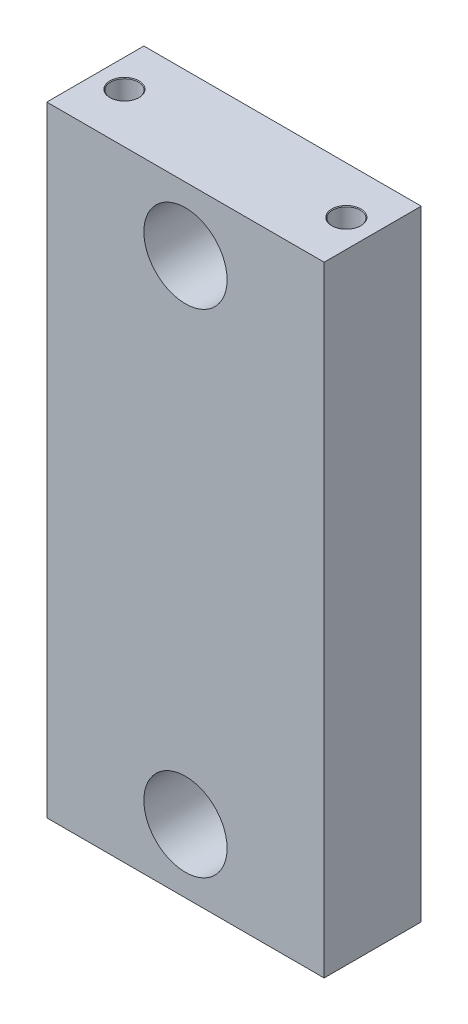
ISO-10303-21;
HEADER;
FILE_DESCRIPTION(('STEP AP214'),'2;1');
FILE_NAME('part.step','',(''),(''),'','','');
FILE_SCHEMA(('AUTOMOTIVE_DESIGN { 1 0 10303 214 1 1 1 1 }'));
ENDSEC;
DATA;
#1=APPLICATION_CONTEXT('core data for automotive mechanical design processes');
#2=APPLICATION_PROTOCOL_DEFINITION('international standard','automotive_design',2000,#1);
#3=PRODUCT_CONTEXT('',#1,'mechanical');
#4=PRODUCT('Part','Part','',(#3));
#5=PRODUCT_RELATED_PRODUCT_CATEGORY('part','',(#4));
#6=PRODUCT_DEFINITION_FORMATION('','',#4);
#7=PRODUCT_DEFINITION_CONTEXT('part definition',#1,'design');
#8=PRODUCT_DEFINITION('design','',#6,#7);
#9=PRODUCT_DEFINITION_SHAPE('','',#8);
#10=(LENGTH_UNIT() NAMED_UNIT(*) SI_UNIT(.MILLI.,.METRE.));
#11=(NAMED_UNIT(*) PLANE_ANGLE_UNIT() SI_UNIT($,.RADIAN.));
#12=(NAMED_UNIT(*) SI_UNIT($,.STERADIAN.) SOLID_ANGLE_UNIT());
#13=UNCERTAINTY_MEASURE_WITH_UNIT(LENGTH_MEASURE(1.E-05),#10,'distance_accuracy_value','');
#14=(GEOMETRIC_REPRESENTATION_CONTEXT(3) GLOBAL_UNCERTAINTY_ASSIGNED_CONTEXT((#13)) GLOBAL_UNIT_ASSIGNED_CONTEXT((#10,
#11,#12)) REPRESENTATION_CONTEXT('',''));
#15=CARTESIAN_POINT('',(0.,0.,0.));
#16=DIRECTION('',(0.,0.,1.));
#17=DIRECTION('',(1.,0.,0.));
#18=AXIS2_PLACEMENT_3D('',#15,#16,#17);
#19=CARTESIAN_POINT('',(0.,-27.35,3.5));
#20=DIRECTION('',(0.,1.,0.));
#21=DIRECTION('',(0.,0.,1.));
#22=AXIS2_PLACEMENT_3D('',#19,#20,#21);
#23=PLANE('',#22);
#24=DIRECTION('',(1.,0.,0.));
#25=VECTOR('',#24,1.);
#26=CARTESIAN_POINT('',(0.,-27.35,0.));
#27=LINE('',#26,#25);
#28=CARTESIAN_POINT('',(-4.99999999999999,-27.35,0.));
#29=VERTEX_POINT('',#28);
#30=CARTESIAN_POINT('',(5.00000000000001,-27.35,0.));
#31=VERTEX_POINT('',#30);
#32=EDGE_CURVE('E161',#29,#31,#27,.T.);
#33=ORIENTED_EDGE('',*,*,#32,.T.);
#34=DIRECTION('',(0.,0.,-1.));
#35=VECTOR('',#34,1.);
#36=CARTESIAN_POINT('',(5.00000000000001,-27.35,3.5));
#37=LINE('',#36,#35);
#38=CARTESIAN_POINT('',(5.00000000000001,-27.35,3.5));
#39=VERTEX_POINT('',#38);
#40=EDGE_CURVE('E11',#39,#31,#37,.T.);
#41=ORIENTED_EDGE('',*,*,#40,.F.);
#42=DIRECTION('',(1.,0.,0.));
#43=VECTOR('',#42,1.);
#44=CARTESIAN_POINT('',(0.,-27.35,3.5));
#45=LINE('',#44,#43);
#46=CARTESIAN_POINT('',(-4.99999999999999,-27.35,3.5));
#47=VERTEX_POINT('',#46);
#48=EDGE_CURVE('E142',#47,#39,#45,.T.);
#49=ORIENTED_EDGE('',*,*,#48,.F.);
#50=DIRECTION('',(0.,0.,-1.));
#51=VECTOR('',#50,1.);
#52=CARTESIAN_POINT('',(-4.99999999999999,-27.35,3.5));
#53=LINE('',#52,#51);
#54=EDGE_CURVE('E67',#47,#29,#53,.T.);
#55=ORIENTED_EDGE('',*,*,#54,.T.);
#56=EDGE_LOOP('',(#33,#41,#49,#55));
#57=FACE_BOUND('',#56,.T.);
#58=ADVANCED_FACE('F49',(#57),#23,.F.);
#59=CARTESIAN_POINT('',(5.00000000000001,0.,3.5));
#60=DIRECTION('',(-1.,0.,0.));
#61=DIRECTION('',(0.,0.,1.));
#62=AXIS2_PLACEMENT_3D('',#59,#60,#61);
#63=PLANE('',#62);
#64=DIRECTION('',(0.,1.,0.));
#65=VECTOR('',#64,1.);
#66=CARTESIAN_POINT('',(5.00000000000001,0.,0.));
#67=LINE('',#66,#65);
#68=CARTESIAN_POINT('',(5.00000000000001,-5.,0.));
#69=VERTEX_POINT('',#68);
#70=EDGE_CURVE('E164',#31,#69,#67,.T.);
#71=ORIENTED_EDGE('',*,*,#70,.T.);
#72=DIRECTION('',(0.,0.,-1.));
#73=VECTOR('',#72,1.);
#74=CARTESIAN_POINT('',(5.00000000000001,-5.,3.5));
#75=LINE('',#74,#73);
#76=CARTESIAN_POINT('',(5.00000000000001,-5.,3.5));
#77=VERTEX_POINT('',#76);
#78=EDGE_CURVE('E59',#77,#69,#75,.T.);
#79=ORIENTED_EDGE('',*,*,#78,.F.);
#80=DIRECTION('',(0.,1.,0.));
#81=VECTOR('',#80,1.);
#82=CARTESIAN_POINT('',(5.00000000000001,0.,3.5));
#83=LINE('',#82,#81);
#84=EDGE_CURVE('E93',#39,#77,#83,.T.);
#85=ORIENTED_EDGE('',*,*,#84,.F.);
#86=ORIENTED_EDGE('',*,*,#40,.T.);
#87=EDGE_LOOP('',(#71,#79,#85,#86));
#88=FACE_BOUND('',#87,.T.);
#89=ADVANCED_FACE('F182',(#88),#63,.F.);
#90=CARTESIAN_POINT('',(0.,-5.,3.5));
#91=DIRECTION('',(0.,1.,0.));
#92=DIRECTION('',(-1.,0.,0.));
#93=AXIS2_PLACEMENT_3D('',#90,#91,#92);
#94=PLANE('',#93);
#95=CARTESIAN_POINT('',(-3.99999999999999,-5.,1.7));
#96=DIRECTION('',(0.,1.,0.));
#97=DIRECTION('',(0.,0.,1.));
#98=AXIS2_PLACEMENT_3D('',#95,#96,#97);
#99=CIRCLE('',#98,0.524999999999999);
#100=CARTESIAN_POINT('',(-3.99999999999999,-5.,2.225));
#101=VERTEX_POINT('',#100);
#102=EDGE_CURVE('E121',#101,#101,#99,.T.);
#103=ORIENTED_EDGE('',*,*,#102,.F.);
#104=EDGE_LOOP('',(#103));
#105=FACE_BOUND('',#104,.T.);
#106=CARTESIAN_POINT('',(4.00000000000001,-5.,1.7));
#107=DIRECTION('',(0.,1.,0.));
#108=DIRECTION('',(0.,0.,1.));
#109=AXIS2_PLACEMENT_3D('',#106,#107,#108);
#110=CIRCLE('',#109,0.524999999999999);
#111=CARTESIAN_POINT('',(4.00000000000001,-5.,2.225));
#112=VERTEX_POINT('',#111);
#113=EDGE_CURVE('E112',#112,#112,#110,.T.);
#114=ORIENTED_EDGE('',*,*,#113,.F.);
#115=EDGE_LOOP('',(#114));
#116=FACE_BOUND('',#115,.T.);
#117=DIRECTION('',(1.,0.,0.));
#118=VECTOR('',#117,1.);
#119=CARTESIAN_POINT('',(0.,-5.,0.));
#120=LINE('',#119,#118);
#121=CARTESIAN_POINT('',(-4.99999999999999,-5.,0.));
#122=VERTEX_POINT('',#121);
#123=EDGE_CURVE('E168',#122,#69,#120,.T.);
#124=ORIENTED_EDGE('',*,*,#123,.F.);
#125=DIRECTION('',(0.,0.,-1.));
#126=VECTOR('',#125,1.);
#127=CARTESIAN_POINT('',(-4.99999999999999,-5.,3.5));
#128=LINE('',#127,#126);
#129=CARTESIAN_POINT('',(-4.99999999999999,-5.,3.5));
#130=VERTEX_POINT('',#129);
#131=EDGE_CURVE('E82',#130,#122,#128,.T.);
#132=ORIENTED_EDGE('',*,*,#131,.F.);
#133=DIRECTION('',(1.,0.,0.));
#134=VECTOR('',#133,1.);
#135=CARTESIAN_POINT('',(0.,-5.,3.5));
#136=LINE('',#135,#134);
#137=EDGE_CURVE('E147',#130,#77,#136,.T.);
#138=ORIENTED_EDGE('',*,*,#137,.T.);
#139=ORIENTED_EDGE('',*,*,#78,.T.);
#140=EDGE_LOOP('',(#124,#132,#138,#139));
#141=FACE_BOUND('',#140,.T.);
#142=ADVANCED_FACE('F180',(#105,#116,#141),#94,.T.);
#143=CARTESIAN_POINT('',(0.,-7.3,3.5));
#144=DIRECTION('',(0.,0.,-1.));
#145=DIRECTION('',(-1.,0.,0.));
#146=AXIS2_PLACEMENT_3D('',#143,#144,#145);
#147=CYLINDRICAL_SURFACE('',#146,1.5);
#148=CARTESIAN_POINT('',(0.,-7.3,3.5));
#149=DIRECTION('',(0.,0.,1.));
#150=DIRECTION('',(1.,0.,0.));
#151=AXIS2_PLACEMENT_3D('',#148,#149,#150);
#152=CIRCLE('',#151,1.5);
#153=CARTESIAN_POINT('',(1.5,-7.3,3.5));
#154=VERTEX_POINT('',#153);
#155=EDGE_CURVE('E137',#154,#154,#152,.T.);
#156=ORIENTED_EDGE('',*,*,#155,.T.);
#157=EDGE_LOOP('',(#156));
#158=FACE_BOUND('',#157,.T.);
#159=CARTESIAN_POINT('',(0.,-7.3,0.));
#160=DIRECTION('',(0.,0.,1.));
#161=DIRECTION('',(1.,0.,0.));
#162=AXIS2_PLACEMENT_3D('',#159,#160,#161);
#163=CIRCLE('',#162,1.5);
#164=CARTESIAN_POINT('',(1.5,-7.3,0.));
#165=VERTEX_POINT('',#164);
#166=EDGE_CURVE('E157',#165,#165,#163,.T.);
#167=ORIENTED_EDGE('',*,*,#166,.F.);
#168=EDGE_LOOP('',(#167));
#169=FACE_BOUND('',#168,.T.);
#170=ADVANCED_FACE('F196',(#158,#169),#147,.F.);
#171=CARTESIAN_POINT('',(0.,-25.05,3.5));
#172=DIRECTION('',(0.,0.,-1.));
#173=DIRECTION('',(-1.,0.,0.));
#174=AXIS2_PLACEMENT_3D('',#171,#172,#173);
#175=CYLINDRICAL_SURFACE('',#174,1.5);
#176=CARTESIAN_POINT('',(0.,-25.05,3.5));
#177=DIRECTION('',(0.,0.,1.));
#178=DIRECTION('',(1.,0.,0.));
#179=AXIS2_PLACEMENT_3D('',#176,#177,#178);
#180=CIRCLE('',#179,1.5);
#181=CARTESIAN_POINT('',(1.5,-25.05,3.5));
#182=VERTEX_POINT('',#181);
#183=EDGE_CURVE('E133',#182,#182,#180,.T.);
#184=ORIENTED_EDGE('',*,*,#183,.T.);
#185=EDGE_LOOP('',(#184));
#186=FACE_BOUND('',#185,.T.);
#187=CARTESIAN_POINT('',(0.,-25.05,0.));
#188=DIRECTION('',(0.,0.,1.));
#189=DIRECTION('',(1.,0.,0.));
#190=AXIS2_PLACEMENT_3D('',#187,#188,#189);
#191=CIRCLE('',#190,1.5);
#192=CARTESIAN_POINT('',(1.5,-25.05,0.));
#193=VERTEX_POINT('',#192);
#194=EDGE_CURVE('E132',#193,#193,#191,.T.);
#195=ORIENTED_EDGE('',*,*,#194,.F.);
#196=EDGE_LOOP('',(#195));
#197=FACE_BOUND('',#196,.T.);
#198=ADVANCED_FACE('F51',(#186,#197),#175,.F.);
#199=CARTESIAN_POINT('',(-4.99999999999999,0.,3.5));
#200=DIRECTION('',(-1.,0.,0.));
#201=DIRECTION('',(0.,0.,1.));
#202=AXIS2_PLACEMENT_3D('',#199,#200,#201);
#203=PLANE('',#202);
#204=DIRECTION('',(0.,1.,0.));
#205=VECTOR('',#204,1.);
#206=CARTESIAN_POINT('',(-4.99999999999999,0.,0.));
#207=LINE('',#206,#205);
#208=EDGE_CURVE('E138',#29,#122,#207,.T.);
#209=ORIENTED_EDGE('',*,*,#208,.F.);
#210=ORIENTED_EDGE('',*,*,#54,.F.);
#211=DIRECTION('',(0.,1.,0.));
#212=VECTOR('',#211,1.);
#213=CARTESIAN_POINT('',(-4.99999999999999,0.,3.5));
#214=LINE('',#213,#212);
#215=EDGE_CURVE('E151',#47,#130,#214,.T.);
#216=ORIENTED_EDGE('',*,*,#215,.T.);
#217=ORIENTED_EDGE('',*,*,#131,.T.);
#218=EDGE_LOOP('',(#209,#210,#216,#217));
#219=FACE_BOUND('',#218,.T.);
#220=ADVANCED_FACE('F186',(#219),#203,.T.);
#221=CARTESIAN_POINT('',(0.,0.,3.5));
#222=DIRECTION('',(0.,0.,1.));
#223=DIRECTION('',(1.,0.,0.));
#224=AXIS2_PLACEMENT_3D('',#221,#222,#223);
#225=PLANE('',#224);
#226=ORIENTED_EDGE('',*,*,#183,.F.);
#227=EDGE_LOOP('',(#226));
#228=FACE_BOUND('',#227,.T.);
#229=ORIENTED_EDGE('',*,*,#155,.F.);
#230=EDGE_LOOP('',(#229));
#231=FACE_BOUND('',#230,.T.);
#232=ORIENTED_EDGE('',*,*,#48,.T.);
#233=ORIENTED_EDGE('',*,*,#84,.T.);
#234=ORIENTED_EDGE('',*,*,#137,.F.);
#235=ORIENTED_EDGE('',*,*,#215,.F.);
#236=EDGE_LOOP('',(#232,#233,#234,#235));
#237=FACE_BOUND('',#236,.T.);
#238=ADVANCED_FACE('F188',(#228,#231,#237),#225,.T.);
#239=CARTESIAN_POINT('',(0.,0.,0.));
#240=DIRECTION('',(0.,0.,1.));
#241=DIRECTION('',(1.,0.,0.));
#242=AXIS2_PLACEMENT_3D('',#239,#240,#241);
#243=PLANE('',#242);
#244=ORIENTED_EDGE('',*,*,#194,.T.);
#245=EDGE_LOOP('',(#244));
#246=FACE_BOUND('',#245,.T.);
#247=ORIENTED_EDGE('',*,*,#166,.T.);
#248=EDGE_LOOP('',(#247));
#249=FACE_BOUND('',#248,.T.);
#250=ORIENTED_EDGE('',*,*,#32,.F.);
#251=ORIENTED_EDGE('',*,*,#208,.T.);
#252=ORIENTED_EDGE('',*,*,#123,.T.);
#253=ORIENTED_EDGE('',*,*,#70,.F.);
#254=EDGE_LOOP('',(#250,#251,#252,#253));
#255=FACE_BOUND('',#254,.T.);
#256=ADVANCED_FACE('F185',(#246,#249,#255),#243,.F.);
#257=CARTESIAN_POINT('',(4.00000000000001,-8.,1.7));
#258=DIRECTION('',(0.,1.,0.));
#259=DIRECTION('',(0.,0.,1.));
#260=AXIS2_PLACEMENT_3D('',#257,#258,#259);
#261=CONICAL_SURFACE('',#260,0.499999999999999,1.02974425867665);
#262=CARTESIAN_POINT('',(4.00000000000001,-8.30043030951378,1.7));
#263=VERTEX_POINT('',#262);
#264=VERTEX_LOOP('',#263);
#265=FACE_BOUND('',#264,.T.);
#266=CARTESIAN_POINT('',(4.00000000000001,-8.,1.7));
#267=DIRECTION('',(0.,1.,0.));
#268=DIRECTION('',(0.,0.,1.));
#269=AXIS2_PLACEMENT_3D('',#266,#267,#268);
#270=CIRCLE('',#269,0.499999999999999);
#271=CARTESIAN_POINT('',(4.00000000000001,-8.,2.2));
#272=VERTEX_POINT('',#271);
#273=EDGE_CURVE('E128',#272,#272,#270,.T.);
#274=ORIENTED_EDGE('',*,*,#273,.T.);
#275=EDGE_LOOP('',(#274));
#276=FACE_BOUND('',#275,.T.);
#277=ADVANCED_FACE('F217',(#265,#276),#261,.F.);
#278=CARTESIAN_POINT('',(4.00000000000001,-5.,1.7));
#279=DIRECTION('',(0.,1.,0.));
#280=DIRECTION('',(0.,0.,1.));
#281=AXIS2_PLACEMENT_3D('',#278,#279,#280);
#282=CYLINDRICAL_SURFACE('',#281,0.499999999999999);
#283=ORIENTED_EDGE('',*,*,#273,.F.);
#284=EDGE_LOOP('',(#283));
#285=FACE_BOUND('',#284,.T.);
#286=CARTESIAN_POINT('',(4.00000000000001,-5.025,1.7));
#287=DIRECTION('',(0.,1.,0.));
#288=DIRECTION('',(0.,0.,1.));
#289=AXIS2_PLACEMENT_3D('',#286,#287,#288);
#290=CIRCLE('',#289,0.5);
#291=CARTESIAN_POINT('',(4.00000000000001,-5.025,2.2));
#292=VERTEX_POINT('',#291);
#293=EDGE_CURVE('E118',#292,#292,#290,.T.);
#294=ORIENTED_EDGE('',*,*,#293,.T.);
#295=EDGE_LOOP('',(#294));
#296=FACE_BOUND('',#295,.T.);
#297=ADVANCED_FACE('F222',(#285,#296),#282,.F.);
#298=CARTESIAN_POINT('',(4.00000000000001,-5.,1.7));
#299=DIRECTION('',(0.,1.,0.));
#300=DIRECTION('',(0.,0.,1.));
#301=AXIS2_PLACEMENT_3D('',#298,#299,#300);
#302=CONICAL_SURFACE('',#301,0.524999999999999,0.785398163397396);
#303=ORIENTED_EDGE('',*,*,#293,.F.);
#304=EDGE_LOOP('',(#303));
#305=FACE_BOUND('',#304,.T.);
#306=ORIENTED_EDGE('',*,*,#113,.T.);
#307=EDGE_LOOP('',(#306));
#308=FACE_BOUND('',#307,.T.);
#309=ADVANCED_FACE('F105',(#305,#308),#302,.F.);
#310=CARTESIAN_POINT('',(-3.99999999999999,-8.,1.7));
#311=DIRECTION('',(0.,1.,0.));
#312=DIRECTION('',(0.,0.,1.));
#313=AXIS2_PLACEMENT_3D('',#310,#311,#312);
#314=CONICAL_SURFACE('',#313,0.499999999999999,1.02974425867665);
#315=CARTESIAN_POINT('',(-3.99999999999999,-8.30043030951378,1.7));
#316=VERTEX_POINT('',#315);
#317=VERTEX_LOOP('',#316);
#318=FACE_BOUND('',#317,.T.);
#319=CARTESIAN_POINT('',(-3.99999999999999,-8.,1.7));
#320=DIRECTION('',(0.,1.,0.));
#321=DIRECTION('',(0.,0.,1.));
#322=AXIS2_PLACEMENT_3D('',#319,#320,#321);
#323=CIRCLE('',#322,0.499999999999999);
#324=CARTESIAN_POINT('',(-3.99999999999999,-8.,2.2));
#325=VERTEX_POINT('',#324);
#326=EDGE_CURVE('E109',#325,#325,#323,.T.);
#327=ORIENTED_EDGE('',*,*,#326,.T.);
#328=EDGE_LOOP('',(#327));
#329=FACE_BOUND('',#328,.T.);
#330=ADVANCED_FACE('F101',(#318,#329),#314,.F.);
#331=CARTESIAN_POINT('',(-3.99999999999999,-5.,1.7));
#332=DIRECTION('',(0.,1.,0.));
#333=DIRECTION('',(0.,0.,1.));
#334=AXIS2_PLACEMENT_3D('',#331,#332,#333);
#335=CYLINDRICAL_SURFACE('',#334,0.499999999999999);
#336=ORIENTED_EDGE('',*,*,#326,.F.);
#337=EDGE_LOOP('',(#336));
#338=FACE_BOUND('',#337,.T.);
#339=CARTESIAN_POINT('',(-3.99999999999999,-5.025,1.7));
#340=DIRECTION('',(0.,1.,0.));
#341=DIRECTION('',(0.,0.,1.));
#342=AXIS2_PLACEMENT_3D('',#339,#340,#341);
#343=CIRCLE('',#342,0.5);
#344=CARTESIAN_POINT('',(-3.99999999999999,-5.025,2.2));
#345=VERTEX_POINT('',#344);
#346=EDGE_CURVE('E113',#345,#345,#343,.T.);
#347=ORIENTED_EDGE('',*,*,#346,.T.);
#348=EDGE_LOOP('',(#347));
#349=FACE_BOUND('',#348,.T.);
#350=ADVANCED_FACE('F104',(#338,#349),#335,.F.);
#351=CARTESIAN_POINT('',(-3.99999999999999,-5.,1.7));
#352=DIRECTION('',(0.,1.,0.));
#353=DIRECTION('',(0.,0.,1.));
#354=AXIS2_PLACEMENT_3D('',#351,#352,#353);
#355=CONICAL_SURFACE('',#354,0.524999999999999,0.785398163397396);
#356=ORIENTED_EDGE('',*,*,#346,.F.);
#357=EDGE_LOOP('',(#356));
#358=FACE_BOUND('',#357,.T.);
#359=ORIENTED_EDGE('',*,*,#102,.T.);
#360=EDGE_LOOP('',(#359));
#361=FACE_BOUND('',#360,.T.);
#362=ADVANCED_FACE('F234',(#358,#361),#355,.F.);
#363=CLOSED_SHELL('',(#58,#89,#142,#170,#198,#220,#238,#256,#277,#297,#309,#330,#350,#362));
#364=MANIFOLD_SOLID_BREP('B2',#363);
#365=ADVANCED_BREP_SHAPE_REPRESENTATION('',(#18,#364),#14);
#366=SHAPE_DEFINITION_REPRESENTATION(#9,#365);
ENDSEC;
END-ISO-10303-21;
